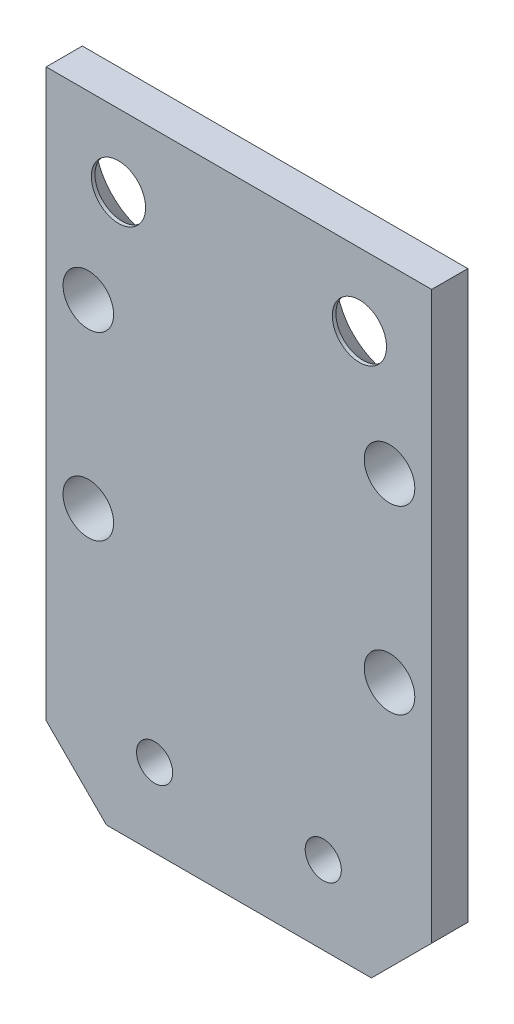
ISO-10303-21;
HEADER;
FILE_DESCRIPTION(('STEP AP214'),'2;1');
FILE_NAME('part.step','',(''),(''),'','','');
FILE_SCHEMA(('AUTOMOTIVE_DESIGN { 1 0 10303 214 1 1 1 1 }'));
ENDSEC;
DATA;
#1=APPLICATION_CONTEXT('core data for automotive mechanical design processes');
#2=APPLICATION_PROTOCOL_DEFINITION('international standard','automotive_design',2000,#1);
#3=PRODUCT_CONTEXT('',#1,'mechanical');
#4=PRODUCT('Part','Part','',(#3));
#5=PRODUCT_RELATED_PRODUCT_CATEGORY('part','',(#4));
#6=PRODUCT_DEFINITION_FORMATION('','',#4);
#7=PRODUCT_DEFINITION_CONTEXT('part definition',#1,'design');
#8=PRODUCT_DEFINITION('design','',#6,#7);
#9=PRODUCT_DEFINITION_SHAPE('','',#8);
#10=(LENGTH_UNIT() NAMED_UNIT(*) SI_UNIT(.MILLI.,.METRE.));
#11=(NAMED_UNIT(*) PLANE_ANGLE_UNIT() SI_UNIT($,.RADIAN.));
#12=(NAMED_UNIT(*) SI_UNIT($,.STERADIAN.) SOLID_ANGLE_UNIT());
#13=UNCERTAINTY_MEASURE_WITH_UNIT(LENGTH_MEASURE(1.E-05),#10,'distance_accuracy_value','');
#14=(GEOMETRIC_REPRESENTATION_CONTEXT(3) GLOBAL_UNCERTAINTY_ASSIGNED_CONTEXT((#13)) GLOBAL_UNIT_ASSIGNED_CONTEXT((#10,
#11,#12)) REPRESENTATION_CONTEXT('',''));
#15=CARTESIAN_POINT('',(0.,0.,0.));
#16=DIRECTION('',(0.,0.,1.));
#17=DIRECTION('',(1.,0.,0.));
#18=AXIS2_PLACEMENT_3D('',#15,#16,#17);
#19=CARTESIAN_POINT('',(16.,26.,3.));
#20=DIRECTION('',(0.,0.,-1.));
#21=DIRECTION('',(-1.,0.,0.));
#22=AXIS2_PLACEMENT_3D('',#19,#20,#21);
#23=PLANE('',#22);
#24=CARTESIAN_POINT('',(10.,20.,3.));
#25=DIRECTION('',(0.,0.,1.));
#26=DIRECTION('',(1.,0.,0.));
#27=AXIS2_PLACEMENT_3D('',#24,#25,#26);
#28=CIRCLE('',#27,2.25);
#29=CARTESIAN_POINT('',(12.25,20.,3.));
#30=VERTEX_POINT('',#29);
#31=EDGE_CURVE('E232',#30,#30,#28,.T.);
#32=ORIENTED_EDGE('',*,*,#31,.F.);
#33=EDGE_LOOP('',(#32));
#34=FACE_BOUND('',#33,.T.);
#35=CARTESIAN_POINT('',(-6.99999999999999,-19.5,3.));
#36=DIRECTION('',(0.,0.,1.));
#37=DIRECTION('',(1.,0.,0.));
#38=AXIS2_PLACEMENT_3D('',#35,#36,#37);
#39=CIRCLE('',#38,1.5);
#40=CARTESIAN_POINT('',(-5.49999999999999,-19.5,3.));
#41=VERTEX_POINT('',#40);
#42=EDGE_CURVE('E220',#41,#41,#39,.T.);
#43=ORIENTED_EDGE('',*,*,#42,.F.);
#44=EDGE_LOOP('',(#43));
#45=FACE_BOUND('',#44,.T.);
#46=CARTESIAN_POINT('',(12.5,-4.,3.));
#47=DIRECTION('',(0.,0.,1.));
#48=DIRECTION('',(1.,0.,0.));
#49=AXIS2_PLACEMENT_3D('',#46,#47,#48);
#50=CIRCLE('',#49,2.1);
#51=CARTESIAN_POINT('',(14.6,-4.,3.));
#52=VERTEX_POINT('',#51);
#53=EDGE_CURVE('E208',#52,#52,#50,.T.);
#54=ORIENTED_EDGE('',*,*,#53,.F.);
#55=EDGE_LOOP('',(#54));
#56=FACE_BOUND('',#55,.T.);
#57=CARTESIAN_POINT('',(-12.5,11.,3.));
#58=DIRECTION('',(0.,0.,1.));
#59=DIRECTION('',(1.,0.,0.));
#60=AXIS2_PLACEMENT_3D('',#57,#58,#59);
#61=CIRCLE('',#60,2.1);
#62=CARTESIAN_POINT('',(-10.4,11.,3.));
#63=VERTEX_POINT('',#62);
#64=EDGE_CURVE('E122',#63,#63,#61,.T.);
#65=ORIENTED_EDGE('',*,*,#64,.F.);
#66=EDGE_LOOP('',(#65));
#67=FACE_BOUND('',#66,.T.);
#68=DIRECTION('',(0.,1.,0.));
#69=VECTOR('',#68,1.);
#70=CARTESIAN_POINT('',(16.,-21.,3.));
#71=LINE('',#70,#69);
#72=CARTESIAN_POINT('',(16.,-21.,3.));
#73=VERTEX_POINT('',#72);
#74=CARTESIAN_POINT('',(16.,26.,3.));
#75=VERTEX_POINT('',#74);
#76=EDGE_CURVE('E129',#73,#75,#71,.T.);
#77=ORIENTED_EDGE('',*,*,#76,.T.);
#78=DIRECTION('',(-1.,0.,0.));
#79=VECTOR('',#78,1.);
#80=CARTESIAN_POINT('',(-16.,26.,3.));
#81=LINE('',#80,#79);
#82=CARTESIAN_POINT('',(-16.,26.,3.));
#83=VERTEX_POINT('',#82);
#84=EDGE_CURVE('E87',#75,#83,#81,.T.);
#85=ORIENTED_EDGE('',*,*,#84,.T.);
#86=DIRECTION('',(0.,-1.,0.));
#87=VECTOR('',#86,1.);
#88=CARTESIAN_POINT('',(-16.,-21.,3.));
#89=LINE('',#88,#87);
#90=CARTESIAN_POINT('',(-16.,-21.,3.));
#91=VERTEX_POINT('',#90);
#92=EDGE_CURVE('E100',#83,#91,#89,.T.);
#93=ORIENTED_EDGE('',*,*,#92,.T.);
#94=DIRECTION('',(0.707106781186548,-0.707106781186548,0.));
#95=VECTOR('',#94,1.);
#96=CARTESIAN_POINT('',(-16.,-21.,3.));
#97=LINE('',#96,#95);
#98=CARTESIAN_POINT('',(-11.,-26.,3.));
#99=VERTEX_POINT('',#98);
#100=EDGE_CURVE('E94',#91,#99,#97,.T.);
#101=ORIENTED_EDGE('',*,*,#100,.T.);
#102=DIRECTION('',(1.,0.,0.));
#103=VECTOR('',#102,1.);
#104=CARTESIAN_POINT('',(-11.,-26.,3.));
#105=LINE('',#104,#103);
#106=CARTESIAN_POINT('',(11.,-26.,3.));
#107=VERTEX_POINT('',#106);
#108=EDGE_CURVE('E98',#99,#107,#105,.T.);
#109=ORIENTED_EDGE('',*,*,#108,.T.);
#110=DIRECTION('',(0.707106781186548,0.707106781186548,0.));
#111=VECTOR('',#110,1.);
#112=CARTESIAN_POINT('',(11.,-26.,3.));
#113=LINE('',#112,#111);
#114=EDGE_CURVE('E49',#107,#73,#113,.T.);
#115=ORIENTED_EDGE('',*,*,#114,.T.);
#116=EDGE_LOOP('',(#77,#85,#93,#101,#109,#115));
#117=FACE_BOUND('',#116,.T.);
#118=CARTESIAN_POINT('',(12.5,11.,3.));
#119=DIRECTION('',(0.,0.,1.));
#120=DIRECTION('',(1.,0.,0.));
#121=AXIS2_PLACEMENT_3D('',#118,#119,#120);
#122=CIRCLE('',#121,2.1);
#123=CARTESIAN_POINT('',(14.6,11.,3.));
#124=VERTEX_POINT('',#123);
#125=EDGE_CURVE('E202',#124,#124,#122,.T.);
#126=ORIENTED_EDGE('',*,*,#125,.F.);
#127=EDGE_LOOP('',(#126));
#128=FACE_BOUND('',#127,.T.);
#129=CARTESIAN_POINT('',(-12.5,-4.,3.));
#130=DIRECTION('',(0.,0.,1.));
#131=DIRECTION('',(1.,0.,0.));
#132=AXIS2_PLACEMENT_3D('',#129,#130,#131);
#133=CIRCLE('',#132,2.1);
#134=CARTESIAN_POINT('',(-10.4,-4.,3.));
#135=VERTEX_POINT('',#134);
#136=EDGE_CURVE('E214',#135,#135,#133,.T.);
#137=ORIENTED_EDGE('',*,*,#136,.F.);
#138=EDGE_LOOP('',(#137));
#139=FACE_BOUND('',#138,.T.);
#140=CARTESIAN_POINT('',(7.00000000000001,-19.5,3.));
#141=DIRECTION('',(0.,0.,1.));
#142=DIRECTION('',(1.,0.,0.));
#143=AXIS2_PLACEMENT_3D('',#140,#141,#142);
#144=CIRCLE('',#143,1.5);
#145=CARTESIAN_POINT('',(8.50000000000001,-19.5,3.));
#146=VERTEX_POINT('',#145);
#147=EDGE_CURVE('E226',#146,#146,#144,.T.);
#148=ORIENTED_EDGE('',*,*,#147,.F.);
#149=EDGE_LOOP('',(#148));
#150=FACE_BOUND('',#149,.T.);
#151=CARTESIAN_POINT('',(-9.99999999999999,20.,3.));
#152=DIRECTION('',(0.,0.,1.));
#153=DIRECTION('',(1.,0.,0.));
#154=AXIS2_PLACEMENT_3D('',#151,#152,#153);
#155=CIRCLE('',#154,2.25);
#156=CARTESIAN_POINT('',(-7.74999999999999,20.,3.));
#157=VERTEX_POINT('',#156);
#158=EDGE_CURVE('E237',#157,#157,#155,.T.);
#159=ORIENTED_EDGE('',*,*,#158,.F.);
#160=EDGE_LOOP('',(#159));
#161=FACE_BOUND('',#160,.T.);
#162=ADVANCED_FACE('F32',(#34,#45,#56,#67,#117,#128,#139,#150,#161),#23,.F.);
#163=CARTESIAN_POINT('',(16.,26.,0.));
#164=DIRECTION('',(0.,0.,-1.));
#165=DIRECTION('',(-1.,0.,0.));
#166=AXIS2_PLACEMENT_3D('',#163,#164,#165);
#167=PLANE('',#166);
#168=CARTESIAN_POINT('',(-9.99999999999999,20.,0.));
#169=DIRECTION('',(0.,0.,-1.));
#170=DIRECTION('',(-1.,0.,0.));
#171=AXIS2_PLACEMENT_3D('',#168,#169,#170);
#172=CIRCLE('',#171,4.95);
#173=CARTESIAN_POINT('',(-14.95,20.,0.));
#174=VERTEX_POINT('',#173);
#175=EDGE_CURVE('E41',#174,#174,#172,.F.);
#176=ORIENTED_EDGE('',*,*,#175,.T.);
#177=EDGE_LOOP('',(#176));
#178=FACE_BOUND('',#177,.T.);
#179=CARTESIAN_POINT('',(10.,20.,0.));
#180=DIRECTION('',(0.,0.,-1.));
#181=DIRECTION('',(-1.,0.,0.));
#182=AXIS2_PLACEMENT_3D('',#179,#180,#181);
#183=CIRCLE('',#182,4.95);
#184=CARTESIAN_POINT('',(5.05,20.,0.));
#185=VERTEX_POINT('',#184);
#186=EDGE_CURVE('E138',#185,#185,#183,.F.);
#187=ORIENTED_EDGE('',*,*,#186,.T.);
#188=EDGE_LOOP('',(#187));
#189=FACE_BOUND('',#188,.T.);
#190=CARTESIAN_POINT('',(-6.99999999999999,-19.5,0.));
#191=DIRECTION('',(0.,0.,1.));
#192=DIRECTION('',(1.,0.,0.));
#193=AXIS2_PLACEMENT_3D('',#190,#191,#192);
#194=CIRCLE('',#193,1.5);
#195=CARTESIAN_POINT('',(-5.49999999999999,-19.5,0.));
#196=VERTEX_POINT('',#195);
#197=EDGE_CURVE('E223',#196,#196,#194,.T.);
#198=ORIENTED_EDGE('',*,*,#197,.T.);
#199=EDGE_LOOP('',(#198));
#200=FACE_BOUND('',#199,.T.);
#201=CARTESIAN_POINT('',(12.5,-4.,0.));
#202=DIRECTION('',(0.,0.,1.));
#203=DIRECTION('',(1.,0.,0.));
#204=AXIS2_PLACEMENT_3D('',#201,#202,#203);
#205=CIRCLE('',#204,2.1);
#206=CARTESIAN_POINT('',(14.6,-4.,0.));
#207=VERTEX_POINT('',#206);
#208=EDGE_CURVE('E211',#207,#207,#205,.T.);
#209=ORIENTED_EDGE('',*,*,#208,.T.);
#210=EDGE_LOOP('',(#209));
#211=FACE_BOUND('',#210,.T.);
#212=CARTESIAN_POINT('',(-12.5,11.,0.));
#213=DIRECTION('',(0.,0.,1.));
#214=DIRECTION('',(1.,0.,0.));
#215=AXIS2_PLACEMENT_3D('',#212,#213,#214);
#216=CIRCLE('',#215,2.1);
#217=CARTESIAN_POINT('',(-10.4,11.,0.));
#218=VERTEX_POINT('',#217);
#219=EDGE_CURVE('E199',#218,#218,#216,.T.);
#220=ORIENTED_EDGE('',*,*,#219,.T.);
#221=EDGE_LOOP('',(#220));
#222=FACE_BOUND('',#221,.T.);
#223=DIRECTION('',(0.,1.,0.));
#224=VECTOR('',#223,1.);
#225=CARTESIAN_POINT('',(16.,-21.,0.));
#226=LINE('',#225,#224);
#227=CARTESIAN_POINT('',(16.,-21.,0.));
#228=VERTEX_POINT('',#227);
#229=CARTESIAN_POINT('',(16.,26.,0.));
#230=VERTEX_POINT('',#229);
#231=EDGE_CURVE('E118',#228,#230,#226,.T.);
#232=ORIENTED_EDGE('',*,*,#231,.F.);
#233=DIRECTION('',(0.707106781186548,0.707106781186548,0.));
#234=VECTOR('',#233,1.);
#235=CARTESIAN_POINT('',(11.,-26.,0.));
#236=LINE('',#235,#234);
#237=CARTESIAN_POINT('',(11.,-26.,0.));
#238=VERTEX_POINT('',#237);
#239=EDGE_CURVE('E78',#238,#228,#236,.T.);
#240=ORIENTED_EDGE('',*,*,#239,.F.);
#241=DIRECTION('',(1.,0.,0.));
#242=VECTOR('',#241,1.);
#243=CARTESIAN_POINT('',(-11.,-26.,0.));
#244=LINE('',#243,#242);
#245=CARTESIAN_POINT('',(-11.,-26.,0.));
#246=VERTEX_POINT('',#245);
#247=EDGE_CURVE('E72',#246,#238,#244,.T.);
#248=ORIENTED_EDGE('',*,*,#247,.F.);
#249=DIRECTION('',(0.707106781186548,-0.707106781186548,0.));
#250=VECTOR('',#249,1.);
#251=CARTESIAN_POINT('',(-16.,-21.,0.));
#252=LINE('',#251,#250);
#253=CARTESIAN_POINT('',(-16.,-21.,0.));
#254=VERTEX_POINT('',#253);
#255=EDGE_CURVE('E108',#254,#246,#252,.T.);
#256=ORIENTED_EDGE('',*,*,#255,.F.);
#257=DIRECTION('',(0.,-1.,0.));
#258=VECTOR('',#257,1.);
#259=CARTESIAN_POINT('',(-16.,-21.,0.));
#260=LINE('',#259,#258);
#261=CARTESIAN_POINT('',(-16.,26.,0.));
#262=VERTEX_POINT('',#261);
#263=EDGE_CURVE('E124',#262,#254,#260,.T.);
#264=ORIENTED_EDGE('',*,*,#263,.F.);
#265=DIRECTION('',(-1.,0.,0.));
#266=VECTOR('',#265,1.);
#267=CARTESIAN_POINT('',(-16.,26.,0.));
#268=LINE('',#267,#266);
#269=EDGE_CURVE('E121',#230,#262,#268,.T.);
#270=ORIENTED_EDGE('',*,*,#269,.F.);
#271=EDGE_LOOP('',(#232,#240,#248,#256,#264,#270));
#272=FACE_BOUND('',#271,.T.);
#273=CARTESIAN_POINT('',(12.5,11.,0.));
#274=DIRECTION('',(0.,0.,1.));
#275=DIRECTION('',(1.,0.,0.));
#276=AXIS2_PLACEMENT_3D('',#273,#274,#275);
#277=CIRCLE('',#276,2.1);
#278=CARTESIAN_POINT('',(14.6,11.,0.));
#279=VERTEX_POINT('',#278);
#280=EDGE_CURVE('E205',#279,#279,#277,.T.);
#281=ORIENTED_EDGE('',*,*,#280,.T.);
#282=EDGE_LOOP('',(#281));
#283=FACE_BOUND('',#282,.T.);
#284=CARTESIAN_POINT('',(-12.5,-4.,0.));
#285=DIRECTION('',(0.,0.,1.));
#286=DIRECTION('',(1.,0.,0.));
#287=AXIS2_PLACEMENT_3D('',#284,#285,#286);
#288=CIRCLE('',#287,2.1);
#289=CARTESIAN_POINT('',(-10.4,-4.,0.));
#290=VERTEX_POINT('',#289);
#291=EDGE_CURVE('E217',#290,#290,#288,.T.);
#292=ORIENTED_EDGE('',*,*,#291,.T.);
#293=EDGE_LOOP('',(#292));
#294=FACE_BOUND('',#293,.T.);
#295=CARTESIAN_POINT('',(7.00000000000001,-19.5,0.));
#296=DIRECTION('',(0.,0.,1.));
#297=DIRECTION('',(1.,0.,0.));
#298=AXIS2_PLACEMENT_3D('',#295,#296,#297);
#299=CIRCLE('',#298,1.5);
#300=CARTESIAN_POINT('',(8.50000000000001,-19.5,0.));
#301=VERTEX_POINT('',#300);
#302=EDGE_CURVE('E229',#301,#301,#299,.T.);
#303=ORIENTED_EDGE('',*,*,#302,.T.);
#304=EDGE_LOOP('',(#303));
#305=FACE_BOUND('',#304,.T.);
#306=ADVANCED_FACE('F146',(#178,#189,#200,#211,#222,#272,#283,#294,#305),#167,.T.);
#307=CARTESIAN_POINT('',(16.,-21.,3.));
#308=DIRECTION('',(-1.,0.,0.));
#309=DIRECTION('',(0.,0.,1.));
#310=AXIS2_PLACEMENT_3D('',#307,#308,#309);
#311=PLANE('',#310);
#312=ORIENTED_EDGE('',*,*,#231,.T.);
#313=DIRECTION('',(0.,0.,-1.));
#314=VECTOR('',#313,1.);
#315=CARTESIAN_POINT('',(16.,26.,3.));
#316=LINE('',#315,#314);
#317=EDGE_CURVE('E136',#75,#230,#316,.T.);
#318=ORIENTED_EDGE('',*,*,#317,.F.);
#319=ORIENTED_EDGE('',*,*,#76,.F.);
#320=DIRECTION('',(0.,0.,-1.));
#321=VECTOR('',#320,1.);
#322=CARTESIAN_POINT('',(16.,-21.,3.));
#323=LINE('',#322,#321);
#324=EDGE_CURVE('E114',#73,#228,#323,.T.);
#325=ORIENTED_EDGE('',*,*,#324,.T.);
#326=EDGE_LOOP('',(#312,#318,#319,#325));
#327=FACE_BOUND('',#326,.T.);
#328=ADVANCED_FACE('F164',(#327),#311,.F.);
#329=CARTESIAN_POINT('',(-16.,26.,3.));
#330=DIRECTION('',(0.,-1.,0.));
#331=DIRECTION('',(0.,0.,-1.));
#332=AXIS2_PLACEMENT_3D('',#329,#330,#331);
#333=PLANE('',#332);
#334=ORIENTED_EDGE('',*,*,#269,.T.);
#335=DIRECTION('',(0.,0.,-1.));
#336=VECTOR('',#335,1.);
#337=CARTESIAN_POINT('',(-16.,26.,3.));
#338=LINE('',#337,#336);
#339=EDGE_CURVE('E133',#83,#262,#338,.T.);
#340=ORIENTED_EDGE('',*,*,#339,.F.);
#341=ORIENTED_EDGE('',*,*,#84,.F.);
#342=ORIENTED_EDGE('',*,*,#317,.T.);
#343=EDGE_LOOP('',(#334,#340,#341,#342));
#344=FACE_BOUND('',#343,.T.);
#345=ADVANCED_FACE('F182',(#344),#333,.F.);
#346=CARTESIAN_POINT('',(-16.,-21.,3.));
#347=DIRECTION('',(1.,0.,0.));
#348=DIRECTION('',(0.,0.,-1.));
#349=AXIS2_PLACEMENT_3D('',#346,#347,#348);
#350=PLANE('',#349);
#351=ORIENTED_EDGE('',*,*,#263,.T.);
#352=DIRECTION('',(0.,0.,-1.));
#353=VECTOR('',#352,1.);
#354=CARTESIAN_POINT('',(-16.,-21.,3.));
#355=LINE('',#354,#353);
#356=EDGE_CURVE('E109',#91,#254,#355,.T.);
#357=ORIENTED_EDGE('',*,*,#356,.F.);
#358=ORIENTED_EDGE('',*,*,#92,.F.);
#359=ORIENTED_EDGE('',*,*,#339,.T.);
#360=EDGE_LOOP('',(#351,#357,#358,#359));
#361=FACE_BOUND('',#360,.T.);
#362=ADVANCED_FACE('F179',(#361),#350,.F.);
#363=CARTESIAN_POINT('',(-16.,-21.,3.));
#364=DIRECTION('',(0.707106781186547,0.707106781186547,0.));
#365=DIRECTION('',(-0.707106781186548,0.707106781186548,0.));
#366=AXIS2_PLACEMENT_3D('',#363,#364,#365);
#367=PLANE('',#366);
#368=ORIENTED_EDGE('',*,*,#255,.T.);
#369=DIRECTION('',(0.,0.,-1.));
#370=VECTOR('',#369,1.);
#371=CARTESIAN_POINT('',(-11.,-26.,3.));
#372=LINE('',#371,#370);
#373=EDGE_CURVE('E105',#99,#246,#372,.T.);
#374=ORIENTED_EDGE('',*,*,#373,.F.);
#375=ORIENTED_EDGE('',*,*,#100,.F.);
#376=ORIENTED_EDGE('',*,*,#356,.T.);
#377=EDGE_LOOP('',(#368,#374,#375,#376));
#378=FACE_BOUND('',#377,.T.);
#379=ADVANCED_FACE('F106',(#378),#367,.F.);
#380=CARTESIAN_POINT('',(-11.,-26.,3.));
#381=DIRECTION('',(0.,1.,0.));
#382=DIRECTION('',(0.,0.,1.));
#383=AXIS2_PLACEMENT_3D('',#380,#381,#382);
#384=PLANE('',#383);
#385=ORIENTED_EDGE('',*,*,#247,.T.);
#386=DIRECTION('',(0.,0.,-1.));
#387=VECTOR('',#386,1.);
#388=CARTESIAN_POINT('',(11.,-26.,3.));
#389=LINE('',#388,#387);
#390=EDGE_CURVE('E110',#107,#238,#389,.T.);
#391=ORIENTED_EDGE('',*,*,#390,.F.);
#392=ORIENTED_EDGE('',*,*,#108,.F.);
#393=ORIENTED_EDGE('',*,*,#373,.T.);
#394=EDGE_LOOP('',(#385,#391,#392,#393));
#395=FACE_BOUND('',#394,.T.);
#396=ADVANCED_FACE('F112',(#395),#384,.F.);
#397=CARTESIAN_POINT('',(11.,-26.,3.));
#398=DIRECTION('',(-0.707106781186547,0.707106781186547,0.));
#399=DIRECTION('',(-0.707106781186548,-0.707106781186548,0.));
#400=AXIS2_PLACEMENT_3D('',#397,#398,#399);
#401=PLANE('',#400);
#402=ORIENTED_EDGE('',*,*,#239,.T.);
#403=ORIENTED_EDGE('',*,*,#324,.F.);
#404=ORIENTED_EDGE('',*,*,#114,.F.);
#405=ORIENTED_EDGE('',*,*,#390,.T.);
#406=EDGE_LOOP('',(#402,#403,#404,#405));
#407=FACE_BOUND('',#406,.T.);
#408=ADVANCED_FACE('F172',(#407),#401,.F.);
#409=CARTESIAN_POINT('',(-12.5,11.,3.));
#410=DIRECTION('',(0.,0.,-1.));
#411=DIRECTION('',(-1.,0.,0.));
#412=AXIS2_PLACEMENT_3D('',#409,#410,#411);
#413=CYLINDRICAL_SURFACE('',#412,2.1);
#414=ORIENTED_EDGE('',*,*,#64,.T.);
#415=EDGE_LOOP('',(#414));
#416=FACE_BOUND('',#415,.T.);
#417=ORIENTED_EDGE('',*,*,#219,.F.);
#418=EDGE_LOOP('',(#417));
#419=FACE_BOUND('',#418,.T.);
#420=ADVANCED_FACE('F169',(#416,#419),#413,.F.);
#421=CARTESIAN_POINT('',(12.5,11.,3.));
#422=DIRECTION('',(0.,0.,-1.));
#423=DIRECTION('',(-1.,0.,0.));
#424=AXIS2_PLACEMENT_3D('',#421,#422,#423);
#425=CYLINDRICAL_SURFACE('',#424,2.1);
#426=ORIENTED_EDGE('',*,*,#125,.T.);
#427=EDGE_LOOP('',(#426));
#428=FACE_BOUND('',#427,.T.);
#429=ORIENTED_EDGE('',*,*,#280,.F.);
#430=EDGE_LOOP('',(#429));
#431=FACE_BOUND('',#430,.T.);
#432=ADVANCED_FACE('F266',(#428,#431),#425,.F.);
#433=CARTESIAN_POINT('',(12.5,-4.,3.));
#434=DIRECTION('',(0.,0.,-1.));
#435=DIRECTION('',(-1.,0.,0.));
#436=AXIS2_PLACEMENT_3D('',#433,#434,#435);
#437=CYLINDRICAL_SURFACE('',#436,2.1);
#438=ORIENTED_EDGE('',*,*,#53,.T.);
#439=EDGE_LOOP('',(#438));
#440=FACE_BOUND('',#439,.T.);
#441=ORIENTED_EDGE('',*,*,#208,.F.);
#442=EDGE_LOOP('',(#441));
#443=FACE_BOUND('',#442,.T.);
#444=ADVANCED_FACE('F263',(#440,#443),#437,.F.);
#445=CARTESIAN_POINT('',(-12.5,-4.,3.));
#446=DIRECTION('',(0.,0.,-1.));
#447=DIRECTION('',(-1.,0.,0.));
#448=AXIS2_PLACEMENT_3D('',#445,#446,#447);
#449=CYLINDRICAL_SURFACE('',#448,2.1);
#450=ORIENTED_EDGE('',*,*,#136,.T.);
#451=EDGE_LOOP('',(#450));
#452=FACE_BOUND('',#451,.T.);
#453=ORIENTED_EDGE('',*,*,#291,.F.);
#454=EDGE_LOOP('',(#453));
#455=FACE_BOUND('',#454,.T.);
#456=ADVANCED_FACE('F259',(#452,#455),#449,.F.);
#457=CARTESIAN_POINT('',(-6.99999999999999,-19.5,3.));
#458=DIRECTION('',(0.,0.,-1.));
#459=DIRECTION('',(-1.,0.,0.));
#460=AXIS2_PLACEMENT_3D('',#457,#458,#459);
#461=CYLINDRICAL_SURFACE('',#460,1.5);
#462=ORIENTED_EDGE('',*,*,#42,.T.);
#463=EDGE_LOOP('',(#462));
#464=FACE_BOUND('',#463,.T.);
#465=ORIENTED_EDGE('',*,*,#197,.F.);
#466=EDGE_LOOP('',(#465));
#467=FACE_BOUND('',#466,.T.);
#468=ADVANCED_FACE('F255',(#464,#467),#461,.F.);
#469=CARTESIAN_POINT('',(7.00000000000001,-19.5,3.));
#470=DIRECTION('',(0.,0.,-1.));
#471=DIRECTION('',(-1.,0.,0.));
#472=AXIS2_PLACEMENT_3D('',#469,#470,#471);
#473=CYLINDRICAL_SURFACE('',#472,1.5);
#474=ORIENTED_EDGE('',*,*,#147,.T.);
#475=EDGE_LOOP('',(#474));
#476=FACE_BOUND('',#475,.T.);
#477=ORIENTED_EDGE('',*,*,#302,.F.);
#478=EDGE_LOOP('',(#477));
#479=FACE_BOUND('',#478,.T.);
#480=ADVANCED_FACE('F249',(#476,#479),#473,.F.);
#481=CARTESIAN_POINT('',(10.,20.,3.));
#482=DIRECTION('',(0.,0.,-1.));
#483=DIRECTION('',(-1.,0.,0.));
#484=AXIS2_PLACEMENT_3D('',#481,#482,#483);
#485=CYLINDRICAL_SURFACE('',#484,2.25);
#486=CARTESIAN_POINT('',(10.,20.,2.70000000000001));
#487=DIRECTION('',(0.,0.,-1.));
#488=DIRECTION('',(-1.,0.,0.));
#489=AXIS2_PLACEMENT_3D('',#486,#487,#488);
#490=CIRCLE('',#489,2.25);
#491=CARTESIAN_POINT('',(7.75,20.,2.70000000000001));
#492=VERTEX_POINT('',#491);
#493=EDGE_CURVE('E141',#492,#492,#490,.T.);
#494=ORIENTED_EDGE('',*,*,#493,.T.);
#495=EDGE_LOOP('',(#494));
#496=FACE_BOUND('',#495,.T.);
#497=ORIENTED_EDGE('',*,*,#31,.T.);
#498=EDGE_LOOP('',(#497));
#499=FACE_BOUND('',#498,.T.);
#500=ADVANCED_FACE('F243',(#496,#499),#485,.F.);
#501=CARTESIAN_POINT('',(-9.99999999999999,20.,3.));
#502=DIRECTION('',(0.,0.,-1.));
#503=DIRECTION('',(-1.,0.,0.));
#504=AXIS2_PLACEMENT_3D('',#501,#502,#503);
#505=CYLINDRICAL_SURFACE('',#504,2.25);
#506=CARTESIAN_POINT('',(-9.99999999999999,20.,2.70000000000001));
#507=DIRECTION('',(0.,0.,-1.));
#508=DIRECTION('',(-1.,0.,0.));
#509=AXIS2_PLACEMENT_3D('',#506,#507,#508);
#510=CIRCLE('',#509,2.25);
#511=CARTESIAN_POINT('',(-12.25,20.,2.70000000000001));
#512=VERTEX_POINT('',#511);
#513=EDGE_CURVE('E11',#512,#512,#510,.T.);
#514=ORIENTED_EDGE('',*,*,#513,.T.);
#515=EDGE_LOOP('',(#514));
#516=FACE_BOUND('',#515,.T.);
#517=ORIENTED_EDGE('',*,*,#158,.T.);
#518=EDGE_LOOP('',(#517));
#519=FACE_BOUND('',#518,.T.);
#520=ADVANCED_FACE('F155',(#516,#519),#505,.F.);
#521=CARTESIAN_POINT('',(10.,20.,0.));
#522=DIRECTION('',(0.,0.,-1.));
#523=DIRECTION('',(-1.,0.,0.));
#524=AXIS2_PLACEMENT_3D('',#521,#522,#523);
#525=CONICAL_SURFACE('',#524,4.95,0.785398163397446);
#526=ORIENTED_EDGE('',*,*,#493,.F.);
#527=EDGE_LOOP('',(#526));
#528=FACE_BOUND('',#527,.T.);
#529=ORIENTED_EDGE('',*,*,#186,.F.);
#530=EDGE_LOOP('',(#529));
#531=FACE_BOUND('',#530,.T.);
#532=ADVANCED_FACE('F150',(#528,#531),#525,.F.);
#533=CARTESIAN_POINT('',(-9.99999999999999,20.,0.));
#534=DIRECTION('',(0.,0.,-1.));
#535=DIRECTION('',(-1.,0.,0.));
#536=AXIS2_PLACEMENT_3D('',#533,#534,#535);
#537=CONICAL_SURFACE('',#536,4.95,0.785398163397447);
#538=ORIENTED_EDGE('',*,*,#513,.F.);
#539=EDGE_LOOP('',(#538));
#540=FACE_BOUND('',#539,.T.);
#541=ORIENTED_EDGE('',*,*,#175,.F.);
#542=EDGE_LOOP('',(#541));
#543=FACE_BOUND('',#542,.T.);
#544=ADVANCED_FACE('F34',(#540,#543),#537,.F.);
#545=CLOSED_SHELL('',(#162,#306,#328,#345,#362,#379,#396,#408,#420,#432,#444,#456,#468,#480,
#500,#520,#532,#544));
#546=MANIFOLD_SOLID_BREP('B2',#545);
#547=ADVANCED_BREP_SHAPE_REPRESENTATION('',(#18,#546),#14);
#548=SHAPE_DEFINITION_REPRESENTATION(#9,#547);
ENDSEC;
END-ISO-10303-21;
